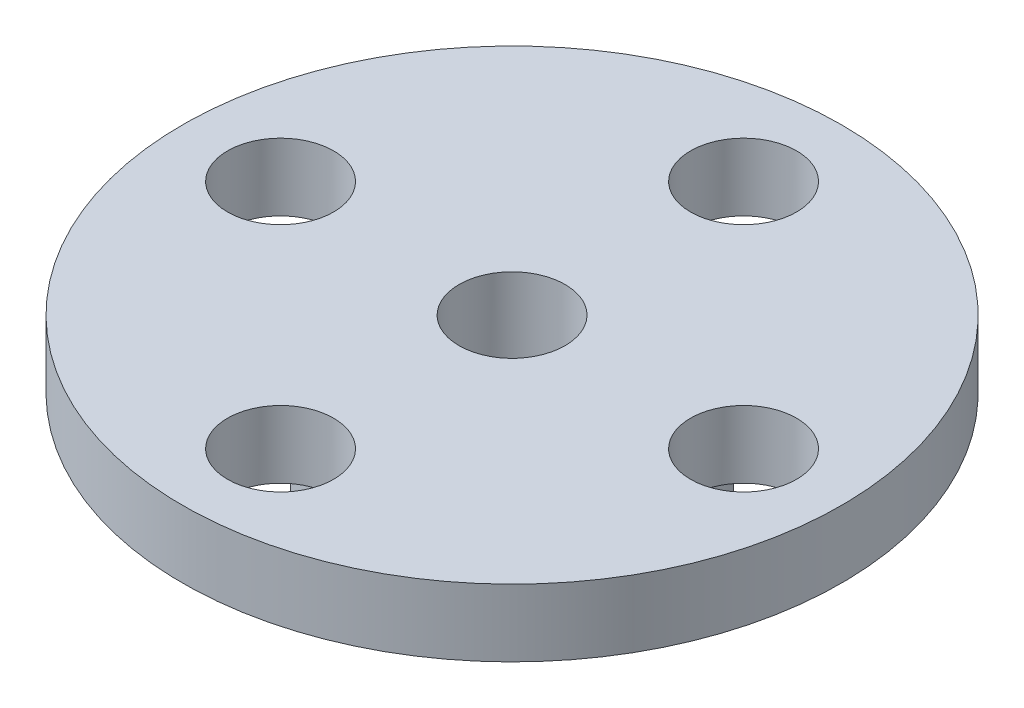
ISO-10303-21;
HEADER;
FILE_DESCRIPTION(('STEP AP214'),'2;1');
FILE_NAME('part.step','',(''),(''),'','','');
FILE_SCHEMA(('AUTOMOTIVE_DESIGN { 1 0 10303 214 1 1 1 1 }'));
ENDSEC;
DATA;
#1=APPLICATION_CONTEXT('core data for automotive mechanical design processes');
#2=APPLICATION_PROTOCOL_DEFINITION('international standard','automotive_design',2000,#1);
#3=PRODUCT_CONTEXT('',#1,'mechanical');
#4=PRODUCT('Part','Part','',(#3));
#5=PRODUCT_RELATED_PRODUCT_CATEGORY('part','',(#4));
#6=PRODUCT_DEFINITION_FORMATION('','',#4);
#7=PRODUCT_DEFINITION_CONTEXT('part definition',#1,'design');
#8=PRODUCT_DEFINITION('design','',#6,#7);
#9=PRODUCT_DEFINITION_SHAPE('','',#8);
#10=(LENGTH_UNIT() NAMED_UNIT(*) SI_UNIT(.MILLI.,.METRE.));
#11=(NAMED_UNIT(*) PLANE_ANGLE_UNIT() SI_UNIT($,.RADIAN.));
#12=(NAMED_UNIT(*) SI_UNIT($,.STERADIAN.) SOLID_ANGLE_UNIT());
#13=UNCERTAINTY_MEASURE_WITH_UNIT(LENGTH_MEASURE(1.E-05),#10,'distance_accuracy_value','');
#14=(GEOMETRIC_REPRESENTATION_CONTEXT(3) GLOBAL_UNCERTAINTY_ASSIGNED_CONTEXT((#13)) GLOBAL_UNIT_ASSIGNED_CONTEXT((#10,
#11,#12)) REPRESENTATION_CONTEXT('',''));
#15=CARTESIAN_POINT('',(0.,0.,0.));
#16=DIRECTION('',(0.,0.,1.));
#17=DIRECTION('',(1.,0.,0.));
#18=AXIS2_PLACEMENT_3D('',#15,#16,#17);
#19=CARTESIAN_POINT('',(0.,5.3848,0.));
#20=DIRECTION('',(0.,1.,0.));
#21=DIRECTION('',(0.,0.,1.));
#22=AXIS2_PLACEMENT_3D('',#19,#20,#21);
#23=PLANE('',#22);
#24=CARTESIAN_POINT('',(-6.985,5.3848,0.));
#25=DIRECTION('',(0.,1.,0.));
#26=DIRECTION('',(0.,0.,1.));
#27=AXIS2_PLACEMENT_3D('',#24,#25,#26);
#28=CIRCLE('',#27,1.6);
#29=CARTESIAN_POINT('',(-6.985,5.3848,1.6));
#30=VERTEX_POINT('',#29);
#31=EDGE_CURVE('E109',#30,#30,#28,.T.);
#32=ORIENTED_EDGE('',*,*,#31,.F.);
#33=EDGE_LOOP('',(#32));
#34=FACE_BOUND('',#33,.T.);
#35=CARTESIAN_POINT('',(0.,5.3848,0.));
#36=DIRECTION('',(0.,1.,0.));
#37=DIRECTION('',(0.,0.,1.));
#38=AXIS2_PLACEMENT_3D('',#35,#36,#37);
#39=CIRCLE('',#38,1.6);
#40=CARTESIAN_POINT('',(0.,5.3848,1.6));
#41=VERTEX_POINT('',#40);
#42=EDGE_CURVE('E68',#41,#41,#39,.T.);
#43=ORIENTED_EDGE('',*,*,#42,.F.);
#44=EDGE_LOOP('',(#43));
#45=FACE_BOUND('',#44,.T.);
#46=CARTESIAN_POINT('',(6.985,5.3848,0.));
#47=DIRECTION('',(0.,1.,0.));
#48=DIRECTION('',(0.,0.,1.));
#49=AXIS2_PLACEMENT_3D('',#46,#47,#48);
#50=CIRCLE('',#49,1.6);
#51=CARTESIAN_POINT('',(6.985,5.3848,1.6));
#52=VERTEX_POINT('',#51);
#53=EDGE_CURVE('E57',#52,#52,#50,.T.);
#54=ORIENTED_EDGE('',*,*,#53,.F.);
#55=EDGE_LOOP('',(#54));
#56=FACE_BOUND('',#55,.T.);
#57=CARTESIAN_POINT('',(0.,5.3848,-6.985));
#58=DIRECTION('',(0.,1.,0.));
#59=DIRECTION('',(0.,0.,1.));
#60=AXIS2_PLACEMENT_3D('',#57,#58,#59);
#61=CIRCLE('',#60,1.6);
#62=CARTESIAN_POINT('',(0.,5.3848,-5.385));
#63=VERTEX_POINT('',#62);
#64=EDGE_CURVE('E56',#63,#63,#61,.T.);
#65=ORIENTED_EDGE('',*,*,#64,.F.);
#66=EDGE_LOOP('',(#65));
#67=FACE_BOUND('',#66,.T.);
#68=CARTESIAN_POINT('',(0.,5.3848,6.985));
#69=DIRECTION('',(0.,1.,0.));
#70=DIRECTION('',(0.,0.,1.));
#71=AXIS2_PLACEMENT_3D('',#68,#69,#70);
#72=CIRCLE('',#71,1.6);
#73=CARTESIAN_POINT('',(0.,5.3848,8.585));
#74=VERTEX_POINT('',#73);
#75=EDGE_CURVE('E53',#74,#74,#72,.T.);
#76=ORIENTED_EDGE('',*,*,#75,.F.);
#77=EDGE_LOOP('',(#76));
#78=FACE_BOUND('',#77,.T.);
#79=CARTESIAN_POINT('',(0.,5.3848,0.));
#80=DIRECTION('',(0.,-1.,0.));
#81=DIRECTION('',(0.,0.,-1.));
#82=AXIS2_PLACEMENT_3D('',#79,#80,#81);
#83=CIRCLE('',#82,9.9441);
#84=CARTESIAN_POINT('',(0.,5.3848,-9.9441));
#85=VERTEX_POINT('',#84);
#86=EDGE_CURVE('E10',#85,#85,#83,.T.);
#87=ORIENTED_EDGE('',*,*,#86,.F.);
#88=EDGE_LOOP('',(#87));
#89=FACE_BOUND('',#88,.T.);
#90=ADVANCED_FACE('F34',(#34,#45,#56,#67,#78,#89),#23,.T.);
#91=CARTESIAN_POINT('',(0.,0.,0.));
#92=DIRECTION('',(0.,-1.,0.));
#93=DIRECTION('',(0.,0.,-1.));
#94=AXIS2_PLACEMENT_3D('',#91,#92,#93);
#95=CYLINDRICAL_SURFACE('',#94,9.9441);
#96=ORIENTED_EDGE('',*,*,#86,.T.);
#97=EDGE_LOOP('',(#96));
#98=FACE_BOUND('',#97,.T.);
#99=CARTESIAN_POINT('',(0.,3.3528,0.));
#100=DIRECTION('',(0.,-1.,0.));
#101=DIRECTION('',(0.,0.,-1.));
#102=AXIS2_PLACEMENT_3D('',#99,#100,#101);
#103=CIRCLE('',#102,9.9441);
#104=CARTESIAN_POINT('',(0.,3.3528,-9.9441));
#105=VERTEX_POINT('',#104);
#106=EDGE_CURVE('E41',#105,#105,#103,.T.);
#107=ORIENTED_EDGE('',*,*,#106,.F.);
#108=EDGE_LOOP('',(#107));
#109=FACE_BOUND('',#108,.T.);
#110=ADVANCED_FACE('F91',(#98,#109),#95,.T.);
#111=CARTESIAN_POINT('',(0.,3.3528,-9.9441));
#112=DIRECTION('',(0.,-1.,0.));
#113=DIRECTION('',(0.,0.,-1.));
#114=AXIS2_PLACEMENT_3D('',#111,#112,#113);
#115=PLANE('',#114);
#116=CARTESIAN_POINT('',(-6.985,3.3528,0.));
#117=DIRECTION('',(0.,-1.,0.));
#118=DIRECTION('',(0.,0.,-1.));
#119=AXIS2_PLACEMENT_3D('',#116,#117,#118);
#120=CIRCLE('',#119,1.6);
#121=CARTESIAN_POINT('',(-6.985,3.3528,-1.6));
#122=VERTEX_POINT('',#121);
#123=EDGE_CURVE('E203',#122,#122,#120,.T.);
#124=ORIENTED_EDGE('',*,*,#123,.F.);
#125=EDGE_LOOP('',(#124));
#126=FACE_BOUND('',#125,.T.);
#127=CARTESIAN_POINT('',(6.985,3.3528,0.));
#128=DIRECTION('',(0.,-1.,0.));
#129=DIRECTION('',(0.,0.,-1.));
#130=AXIS2_PLACEMENT_3D('',#127,#128,#129);
#131=CIRCLE('',#130,1.6);
#132=CARTESIAN_POINT('',(6.985,3.3528,-1.6));
#133=VERTEX_POINT('',#132);
#134=EDGE_CURVE('E54',#133,#133,#131,.T.);
#135=ORIENTED_EDGE('',*,*,#134,.F.);
#136=EDGE_LOOP('',(#135));
#137=FACE_BOUND('',#136,.T.);
#138=CARTESIAN_POINT('',(0.,3.3528,-6.985));
#139=DIRECTION('',(0.,-1.,0.));
#140=DIRECTION('',(0.,0.,-1.));
#141=AXIS2_PLACEMENT_3D('',#138,#139,#140);
#142=CIRCLE('',#141,1.6);
#143=CARTESIAN_POINT('',(0.,3.3528,-8.585));
#144=VERTEX_POINT('',#143);
#145=EDGE_CURVE('E61',#144,#144,#142,.T.);
#146=ORIENTED_EDGE('',*,*,#145,.F.);
#147=EDGE_LOOP('',(#146));
#148=FACE_BOUND('',#147,.T.);
#149=CARTESIAN_POINT('',(0.,3.3528,6.985));
#150=DIRECTION('',(0.,-1.,0.));
#151=DIRECTION('',(0.,0.,-1.));
#152=AXIS2_PLACEMENT_3D('',#149,#150,#151);
#153=CIRCLE('',#152,1.6);
#154=CARTESIAN_POINT('',(0.,3.3528,5.385));
#155=VERTEX_POINT('',#154);
#156=EDGE_CURVE('E50',#155,#155,#153,.T.);
#157=ORIENTED_EDGE('',*,*,#156,.F.);
#158=EDGE_LOOP('',(#157));
#159=FACE_BOUND('',#158,.T.);
#160=ORIENTED_EDGE('',*,*,#106,.T.);
#161=EDGE_LOOP('',(#160));
#162=FACE_BOUND('',#161,.T.);
#163=CARTESIAN_POINT('',(0.,3.3528,0.));
#164=DIRECTION('',(0.,-1.,0.));
#165=DIRECTION('',(0.,0.,-1.));
#166=AXIS2_PLACEMENT_3D('',#163,#164,#165);
#167=CIRCLE('',#166,4.7244);
#168=CARTESIAN_POINT('',(0.,3.3528,-4.7244));
#169=VERTEX_POINT('',#168);
#170=EDGE_CURVE('E46',#169,#169,#167,.T.);
#171=ORIENTED_EDGE('',*,*,#170,.F.);
#172=EDGE_LOOP('',(#171));
#173=FACE_BOUND('',#172,.T.);
#174=ADVANCED_FACE('F89',(#126,#137,#148,#159,#162,#173),#115,.T.);
#175=CARTESIAN_POINT('',(0.,0.,0.));
#176=DIRECTION('',(0.,-1.,0.));
#177=DIRECTION('',(0.,0.,-1.));
#178=AXIS2_PLACEMENT_3D('',#175,#176,#177);
#179=CYLINDRICAL_SURFACE('',#178,4.7244);
#180=ORIENTED_EDGE('',*,*,#170,.T.);
#181=EDGE_LOOP('',(#180));
#182=FACE_BOUND('',#181,.T.);
#183=CARTESIAN_POINT('',(0.,0.,0.));
#184=DIRECTION('',(0.,-1.,0.));
#185=DIRECTION('',(0.,0.,-1.));
#186=AXIS2_PLACEMENT_3D('',#183,#184,#185);
#187=CIRCLE('',#186,4.7244);
#188=CARTESIAN_POINT('',(0.,0.,-4.7244));
#189=VERTEX_POINT('',#188);
#190=EDGE_CURVE('E79',#189,#189,#187,.T.);
#191=ORIENTED_EDGE('',*,*,#190,.F.);
#192=EDGE_LOOP('',(#191));
#193=FACE_BOUND('',#192,.T.);
#194=ADVANCED_FACE('F86',(#182,#193),#179,.T.);
#195=CARTESIAN_POINT('',(0.,0.,-4.7244));
#196=DIRECTION('',(0.,-1.,0.));
#197=DIRECTION('',(0.,0.,-1.));
#198=AXIS2_PLACEMENT_3D('',#195,#196,#197);
#199=PLANE('',#198);
#200=CARTESIAN_POINT('',(0.,0.,0.));
#201=DIRECTION('',(0.,-1.,0.));
#202=DIRECTION('',(0.,0.,-1.));
#203=AXIS2_PLACEMENT_3D('',#200,#201,#202);
#204=CIRCLE('',#203,2.667);
#205=CARTESIAN_POINT('',(0.,0.,-2.667));
#206=VERTEX_POINT('',#205);
#207=EDGE_CURVE('E52',#206,#206,#204,.T.);
#208=ORIENTED_EDGE('',*,*,#207,.F.);
#209=EDGE_LOOP('',(#208));
#210=FACE_BOUND('',#209,.T.);
#211=ORIENTED_EDGE('',*,*,#190,.T.);
#212=EDGE_LOOP('',(#211));
#213=FACE_BOUND('',#212,.T.);
#214=ADVANCED_FACE('F98',(#210,#213),#199,.T.);
#215=CARTESIAN_POINT('',(0.,2.921,0.));
#216=DIRECTION('',(0.,-1.,0.));
#217=DIRECTION('',(0.,0.,-1.));
#218=AXIS2_PLACEMENT_3D('',#215,#216,#217);
#219=CYLINDRICAL_SURFACE('',#218,2.667);
#220=CARTESIAN_POINT('',(0.,2.921,0.));
#221=DIRECTION('',(0.,-1.,0.));
#222=DIRECTION('',(0.,0.,-1.));
#223=AXIS2_PLACEMENT_3D('',#220,#221,#222);
#224=CIRCLE('',#223,2.667);
#225=CARTESIAN_POINT('',(0.,2.921,-2.667));
#226=VERTEX_POINT('',#225);
#227=EDGE_CURVE('E76',#226,#226,#224,.T.);
#228=ORIENTED_EDGE('',*,*,#227,.F.);
#229=EDGE_LOOP('',(#228));
#230=FACE_BOUND('',#229,.T.);
#231=ORIENTED_EDGE('',*,*,#207,.T.);
#232=EDGE_LOOP('',(#231));
#233=FACE_BOUND('',#232,.T.);
#234=ADVANCED_FACE('F132',(#230,#233),#219,.F.);
#235=CARTESIAN_POINT('',(0.,2.921,0.));
#236=DIRECTION('',(0.,-1.,0.));
#237=DIRECTION('',(0.,0.,-1.));
#238=AXIS2_PLACEMENT_3D('',#235,#236,#237);
#239=PLANE('',#238);
#240=CARTESIAN_POINT('',(0.,2.921,0.));
#241=DIRECTION('',(0.,-1.,0.));
#242=DIRECTION('',(0.,0.,-1.));
#243=AXIS2_PLACEMENT_3D('',#240,#241,#242);
#244=CIRCLE('',#243,1.6);
#245=CARTESIAN_POINT('',(0.,2.921,-1.6));
#246=VERTEX_POINT('',#245);
#247=EDGE_CURVE('E37',#246,#246,#244,.T.);
#248=ORIENTED_EDGE('',*,*,#247,.F.);
#249=EDGE_LOOP('',(#248));
#250=FACE_BOUND('',#249,.T.);
#251=ORIENTED_EDGE('',*,*,#227,.T.);
#252=EDGE_LOOP('',(#251));
#253=FACE_BOUND('',#252,.T.);
#254=ADVANCED_FACE('F122',(#250,#253),#239,.T.);
#255=CARTESIAN_POINT('',(0.,5.3848,6.985));
#256=DIRECTION('',(0.,1.,0.));
#257=DIRECTION('',(0.,0.,1.));
#258=AXIS2_PLACEMENT_3D('',#255,#256,#257);
#259=CYLINDRICAL_SURFACE('',#258,1.6);
#260=ORIENTED_EDGE('',*,*,#156,.T.);
#261=EDGE_LOOP('',(#260));
#262=FACE_BOUND('',#261,.T.);
#263=ORIENTED_EDGE('',*,*,#75,.T.);
#264=EDGE_LOOP('',(#263));
#265=FACE_BOUND('',#264,.T.);
#266=ADVANCED_FACE('F119',(#262,#265),#259,.F.);
#267=CARTESIAN_POINT('',(0.,5.3848,-6.985));
#268=DIRECTION('',(0.,1.,0.));
#269=DIRECTION('',(0.,0.,1.));
#270=AXIS2_PLACEMENT_3D('',#267,#268,#269);
#271=CYLINDRICAL_SURFACE('',#270,1.6);
#272=ORIENTED_EDGE('',*,*,#145,.T.);
#273=EDGE_LOOP('',(#272));
#274=FACE_BOUND('',#273,.T.);
#275=ORIENTED_EDGE('',*,*,#64,.T.);
#276=EDGE_LOOP('',(#275));
#277=FACE_BOUND('',#276,.T.);
#278=ADVANCED_FACE('F121',(#274,#277),#271,.F.);
#279=CARTESIAN_POINT('',(6.985,5.3848,0.));
#280=DIRECTION('',(0.,1.,0.));
#281=DIRECTION('',(0.,0.,1.));
#282=AXIS2_PLACEMENT_3D('',#279,#280,#281);
#283=CYLINDRICAL_SURFACE('',#282,1.6);
#284=ORIENTED_EDGE('',*,*,#134,.T.);
#285=EDGE_LOOP('',(#284));
#286=FACE_BOUND('',#285,.T.);
#287=ORIENTED_EDGE('',*,*,#53,.T.);
#288=EDGE_LOOP('',(#287));
#289=FACE_BOUND('',#288,.T.);
#290=ADVANCED_FACE('F129',(#286,#289),#283,.F.);
#291=CARTESIAN_POINT('',(0.,5.3848,0.));
#292=DIRECTION('',(0.,1.,0.));
#293=DIRECTION('',(0.,0.,1.));
#294=AXIS2_PLACEMENT_3D('',#291,#292,#293);
#295=CYLINDRICAL_SURFACE('',#294,1.6);
#296=ORIENTED_EDGE('',*,*,#247,.T.);
#297=EDGE_LOOP('',(#296));
#298=FACE_BOUND('',#297,.T.);
#299=ORIENTED_EDGE('',*,*,#42,.T.);
#300=EDGE_LOOP('',(#299));
#301=FACE_BOUND('',#300,.T.);
#302=ADVANCED_FACE('F179',(#298,#301),#295,.F.);
#303=CARTESIAN_POINT('',(-6.985,5.3848,0.));
#304=DIRECTION('',(0.,1.,0.));
#305=DIRECTION('',(0.,0.,1.));
#306=AXIS2_PLACEMENT_3D('',#303,#304,#305);
#307=CYLINDRICAL_SURFACE('',#306,1.6);
#308=ORIENTED_EDGE('',*,*,#123,.T.);
#309=EDGE_LOOP('',(#308));
#310=FACE_BOUND('',#309,.T.);
#311=ORIENTED_EDGE('',*,*,#31,.T.);
#312=EDGE_LOOP('',(#311));
#313=FACE_BOUND('',#312,.T.);
#314=ADVANCED_FACE('F187',(#310,#313),#307,.F.);
#315=CLOSED_SHELL('',(#90,#110,#174,#194,#214,#234,#254,#266,#278,#290,#302,#314));
#316=MANIFOLD_SOLID_BREP('B2',#315);
#317=ADVANCED_BREP_SHAPE_REPRESENTATION('',(#18,#316),#14);
#318=SHAPE_DEFINITION_REPRESENTATION(#9,#317);
ENDSEC;
END-ISO-10303-21;
